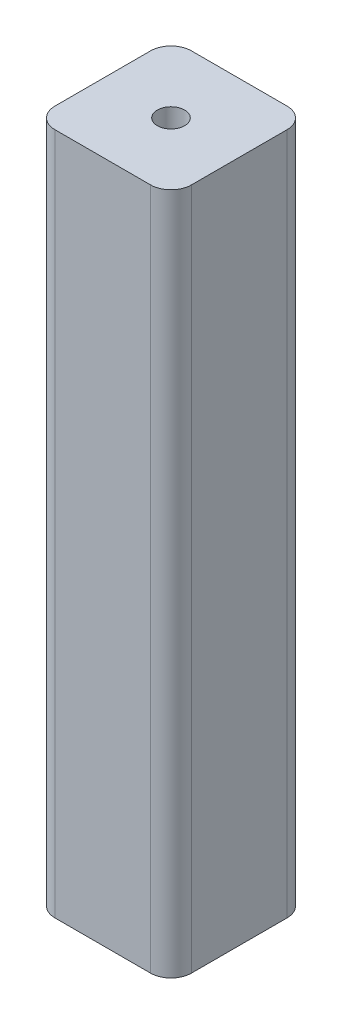
ISO-10303-21;
HEADER;
FILE_DESCRIPTION(('STEP AP214'),'2;1');
FILE_NAME('part.step','',(''),(''),'','','');
FILE_SCHEMA(('AUTOMOTIVE_DESIGN { 1 0 10303 214 1 1 1 1 }'));
ENDSEC;
DATA;
#1=APPLICATION_CONTEXT('core data for automotive mechanical design processes');
#2=APPLICATION_PROTOCOL_DEFINITION('international standard','automotive_design',2000,#1);
#3=PRODUCT_CONTEXT('',#1,'mechanical');
#4=PRODUCT('Part','Part','',(#3));
#5=PRODUCT_RELATED_PRODUCT_CATEGORY('part','',(#4));
#6=PRODUCT_DEFINITION_FORMATION('','',#4);
#7=PRODUCT_DEFINITION_CONTEXT('part definition',#1,'design');
#8=PRODUCT_DEFINITION('design','',#6,#7);
#9=PRODUCT_DEFINITION_SHAPE('','',#8);
#10=(LENGTH_UNIT() NAMED_UNIT(*) SI_UNIT(.MILLI.,.METRE.));
#11=(NAMED_UNIT(*) PLANE_ANGLE_UNIT() SI_UNIT($,.RADIAN.));
#12=(NAMED_UNIT(*) SI_UNIT($,.STERADIAN.) SOLID_ANGLE_UNIT());
#13=UNCERTAINTY_MEASURE_WITH_UNIT(LENGTH_MEASURE(1.E-05),#10,'distance_accuracy_value','');
#14=(GEOMETRIC_REPRESENTATION_CONTEXT(3) GLOBAL_UNCERTAINTY_ASSIGNED_CONTEXT((#13)) GLOBAL_UNIT_ASSIGNED_CONTEXT((#10,
#11,#12)) REPRESENTATION_CONTEXT('',''));
#15=CARTESIAN_POINT('',(0.,0.,0.));
#16=DIRECTION('',(0.,0.,1.));
#17=DIRECTION('',(1.,0.,0.));
#18=AXIS2_PLACEMENT_3D('',#15,#16,#17);
#19=CARTESIAN_POINT('',(-10.,100.,10.));
#20=DIRECTION('',(1.,0.,0.));
#21=DIRECTION('',(0.,0.,-1.));
#22=AXIS2_PLACEMENT_3D('',#19,#20,#21);
#23=PLANE('',#22);
#24=DIRECTION('',(0.,0.,1.));
#25=VECTOR('',#24,1.);
#26=CARTESIAN_POINT('',(-10.,0.,10.));
#27=LINE('',#26,#25);
#28=CARTESIAN_POINT('',(-10.,0.,-7.));
#29=VERTEX_POINT('',#28);
#30=CARTESIAN_POINT('',(-10.,0.,7.));
#31=VERTEX_POINT('',#30);
#32=EDGE_CURVE('E181',#29,#31,#27,.T.);
#33=ORIENTED_EDGE('',*,*,#32,.T.);
#34=DIRECTION('',(0.,-1.,0.));
#35=VECTOR('',#34,1.);
#36=CARTESIAN_POINT('',(-10.,100.,7.));
#37=LINE('',#36,#35);
#38=CARTESIAN_POINT('',(-10.,100.,7.));
#39=VERTEX_POINT('',#38);
#40=EDGE_CURVE('E11',#31,#39,#37,.F.);
#41=ORIENTED_EDGE('',*,*,#40,.T.);
#42=DIRECTION('',(0.,0.,1.));
#43=VECTOR('',#42,1.);
#44=CARTESIAN_POINT('',(-10.,100.,10.));
#45=LINE('',#44,#43);
#46=CARTESIAN_POINT('',(-10.,100.,-7.));
#47=VERTEX_POINT('',#46);
#48=EDGE_CURVE('E134',#47,#39,#45,.T.);
#49=ORIENTED_EDGE('',*,*,#48,.F.);
#50=DIRECTION('',(0.,-1.,0.));
#51=VECTOR('',#50,1.);
#52=CARTESIAN_POINT('',(-10.,100.,-7.));
#53=LINE('',#52,#51);
#54=EDGE_CURVE('E47',#47,#29,#53,.T.);
#55=ORIENTED_EDGE('',*,*,#54,.T.);
#56=EDGE_LOOP('',(#33,#41,#49,#55));
#57=FACE_BOUND('',#56,.T.);
#58=ADVANCED_FACE('F38',(#57),#23,.F.);
#59=CARTESIAN_POINT('',(10.,100.,10.));
#60=DIRECTION('',(0.,0.,-1.));
#61=DIRECTION('',(-1.,0.,0.));
#62=AXIS2_PLACEMENT_3D('',#59,#60,#61);
#63=PLANE('',#62);
#64=DIRECTION('',(1.,0.,0.));
#65=VECTOR('',#64,1.);
#66=CARTESIAN_POINT('',(10.,0.,10.));
#67=LINE('',#66,#65);
#68=CARTESIAN_POINT('',(-7.,0.,10.));
#69=VERTEX_POINT('',#68);
#70=CARTESIAN_POINT('',(7.,0.,10.));
#71=VERTEX_POINT('',#70);
#72=EDGE_CURVE('E141',#69,#71,#67,.T.);
#73=ORIENTED_EDGE('',*,*,#72,.T.);
#74=DIRECTION('',(0.,-1.,0.));
#75=VECTOR('',#74,1.);
#76=CARTESIAN_POINT('',(7.,100.,10.));
#77=LINE('',#76,#75);
#78=CARTESIAN_POINT('',(7.,100.,10.));
#79=VERTEX_POINT('',#78);
#80=EDGE_CURVE('E54',#71,#79,#77,.F.);
#81=ORIENTED_EDGE('',*,*,#80,.T.);
#82=DIRECTION('',(1.,0.,0.));
#83=VECTOR('',#82,1.);
#84=CARTESIAN_POINT('',(10.,100.,10.));
#85=LINE('',#84,#83);
#86=CARTESIAN_POINT('',(-7.,100.,10.));
#87=VERTEX_POINT('',#86);
#88=EDGE_CURVE('E139',#87,#79,#85,.T.);
#89=ORIENTED_EDGE('',*,*,#88,.F.);
#90=DIRECTION('',(0.,-1.,0.));
#91=VECTOR('',#90,1.);
#92=CARTESIAN_POINT('',(-7.,100.,10.));
#93=LINE('',#92,#91);
#94=EDGE_CURVE('E170',#87,#69,#93,.T.);
#95=ORIENTED_EDGE('',*,*,#94,.T.);
#96=EDGE_LOOP('',(#73,#81,#89,#95));
#97=FACE_BOUND('',#96,.T.);
#98=ADVANCED_FACE('F227',(#97),#63,.F.);
#99=CARTESIAN_POINT('',(10.,100.,10.));
#100=DIRECTION('',(-1.,0.,0.));
#101=DIRECTION('',(0.,0.,1.));
#102=AXIS2_PLACEMENT_3D('',#99,#100,#101);
#103=PLANE('',#102);
#104=DIRECTION('',(0.,0.,-1.));
#105=VECTOR('',#104,1.);
#106=CARTESIAN_POINT('',(10.,0.,10.));
#107=LINE('',#106,#105);
#108=CARTESIAN_POINT('',(10.,0.,7.));
#109=VERTEX_POINT('',#108);
#110=CARTESIAN_POINT('',(10.,0.,-7.));
#111=VERTEX_POINT('',#110);
#112=EDGE_CURVE('E135',#109,#111,#107,.T.);
#113=ORIENTED_EDGE('',*,*,#112,.T.);
#114=DIRECTION('',(0.,-1.,0.));
#115=VECTOR('',#114,1.);
#116=CARTESIAN_POINT('',(10.,100.,-7.));
#117=LINE('',#116,#115);
#118=CARTESIAN_POINT('',(10.,100.,-7.));
#119=VERTEX_POINT('',#118);
#120=EDGE_CURVE('E110',#111,#119,#117,.F.);
#121=ORIENTED_EDGE('',*,*,#120,.T.);
#122=DIRECTION('',(0.,0.,-1.));
#123=VECTOR('',#122,1.);
#124=CARTESIAN_POINT('',(10.,100.,10.));
#125=LINE('',#124,#123);
#126=CARTESIAN_POINT('',(10.,100.,7.));
#127=VERTEX_POINT('',#126);
#128=EDGE_CURVE('E197',#127,#119,#125,.T.);
#129=ORIENTED_EDGE('',*,*,#128,.F.);
#130=DIRECTION('',(0.,-1.,0.));
#131=VECTOR('',#130,1.);
#132=CARTESIAN_POINT('',(10.,100.,7.));
#133=LINE('',#132,#131);
#134=EDGE_CURVE('E116',#127,#109,#133,.T.);
#135=ORIENTED_EDGE('',*,*,#134,.T.);
#136=EDGE_LOOP('',(#113,#121,#129,#135));
#137=FACE_BOUND('',#136,.T.);
#138=ADVANCED_FACE('F232',(#137),#103,.F.);
#139=CARTESIAN_POINT('',(10.,100.,-10.));
#140=DIRECTION('',(0.,0.,1.));
#141=DIRECTION('',(1.,0.,0.));
#142=AXIS2_PLACEMENT_3D('',#139,#140,#141);
#143=PLANE('',#142);
#144=DIRECTION('',(-1.,0.,0.));
#145=VECTOR('',#144,1.);
#146=CARTESIAN_POINT('',(10.,100.,-10.));
#147=LINE('',#146,#145);
#148=CARTESIAN_POINT('',(7.,100.,-10.));
#149=VERTEX_POINT('',#148);
#150=CARTESIAN_POINT('',(-7.,100.,-10.));
#151=VERTEX_POINT('',#150);
#152=EDGE_CURVE('E126',#149,#151,#147,.T.);
#153=ORIENTED_EDGE('',*,*,#152,.F.);
#154=DIRECTION('',(0.,-1.,0.));
#155=VECTOR('',#154,1.);
#156=CARTESIAN_POINT('',(7.,100.,-10.));
#157=LINE('',#156,#155);
#158=CARTESIAN_POINT('',(7.,0.,-10.));
#159=VERTEX_POINT('',#158);
#160=EDGE_CURVE('E109',#149,#159,#157,.T.);
#161=ORIENTED_EDGE('',*,*,#160,.T.);
#162=DIRECTION('',(-1.,0.,0.));
#163=VECTOR('',#162,1.);
#164=CARTESIAN_POINT('',(10.,0.,-10.));
#165=LINE('',#164,#163);
#166=CARTESIAN_POINT('',(-7.,0.,-10.));
#167=VERTEX_POINT('',#166);
#168=EDGE_CURVE('E123',#159,#167,#165,.T.);
#169=ORIENTED_EDGE('',*,*,#168,.T.);
#170=DIRECTION('',(0.,-1.,0.));
#171=VECTOR('',#170,1.);
#172=CARTESIAN_POINT('',(-7.,100.,-10.));
#173=LINE('',#172,#171);
#174=EDGE_CURVE('E129',#167,#151,#173,.F.);
#175=ORIENTED_EDGE('',*,*,#174,.T.);
#176=EDGE_LOOP('',(#153,#161,#169,#175));
#177=FACE_BOUND('',#176,.T.);
#178=ADVANCED_FACE('F122',(#177),#143,.F.);
#179=CARTESIAN_POINT('',(0.,100.,0.));
#180=DIRECTION('',(0.,1.,0.));
#181=DIRECTION('',(0.,0.,1.));
#182=AXIS2_PLACEMENT_3D('',#179,#180,#181);
#183=PLANE('',#182);
#184=CARTESIAN_POINT('',(0.,100.,0.));
#185=DIRECTION('',(0.,1.,0.));
#186=DIRECTION('',(0.,0.,1.));
#187=AXIS2_PLACEMENT_3D('',#184,#185,#186);
#188=CIRCLE('',#187,2.);
#189=CARTESIAN_POINT('',(0.,100.,2.));
#190=VERTEX_POINT('',#189);
#191=EDGE_CURVE('E192',#190,#190,#188,.T.);
#192=ORIENTED_EDGE('',*,*,#191,.F.);
#193=EDGE_LOOP('',(#192));
#194=FACE_BOUND('',#193,.T.);
#195=ORIENTED_EDGE('',*,*,#128,.T.);
#196=CARTESIAN_POINT('',(7.,100.,-7.));
#197=DIRECTION('',(0.,1.,0.));
#198=DIRECTION('',(0.,0.,1.));
#199=AXIS2_PLACEMENT_3D('',#196,#197,#198);
#200=CIRCLE('',#199,3.);
#201=EDGE_CURVE('E167',#119,#149,#200,.T.);
#202=ORIENTED_EDGE('',*,*,#201,.T.);
#203=ORIENTED_EDGE('',*,*,#152,.T.);
#204=CARTESIAN_POINT('',(-7.,100.,-7.));
#205=DIRECTION('',(0.,1.,0.));
#206=DIRECTION('',(0.,0.,1.));
#207=AXIS2_PLACEMENT_3D('',#204,#205,#206);
#208=CIRCLE('',#207,3.);
#209=EDGE_CURVE('E159',#151,#47,#208,.T.);
#210=ORIENTED_EDGE('',*,*,#209,.T.);
#211=ORIENTED_EDGE('',*,*,#48,.T.);
#212=CARTESIAN_POINT('',(-7.,100.,7.));
#213=DIRECTION('',(0.,1.,0.));
#214=DIRECTION('',(0.,0.,1.));
#215=AXIS2_PLACEMENT_3D('',#212,#213,#214);
#216=CIRCLE('',#215,3.);
#217=EDGE_CURVE('E61',#39,#87,#216,.T.);
#218=ORIENTED_EDGE('',*,*,#217,.T.);
#219=ORIENTED_EDGE('',*,*,#88,.T.);
#220=CARTESIAN_POINT('',(7.,100.,7.));
#221=DIRECTION('',(0.,1.,0.));
#222=DIRECTION('',(0.,0.,1.));
#223=AXIS2_PLACEMENT_3D('',#220,#221,#222);
#224=CIRCLE('',#223,3.);
#225=EDGE_CURVE('E164',#79,#127,#224,.T.);
#226=ORIENTED_EDGE('',*,*,#225,.T.);
#227=EDGE_LOOP('',(#195,#202,#203,#210,#211,#218,#219,#226));
#228=FACE_BOUND('',#227,.T.);
#229=ADVANCED_FACE('F253',(#194,#228),#183,.T.);
#230=CARTESIAN_POINT('',(0.,0.,0.));
#231=DIRECTION('',(0.,1.,0.));
#232=DIRECTION('',(0.,0.,1.));
#233=AXIS2_PLACEMENT_3D('',#230,#231,#232);
#234=PLANE('',#233);
#235=CARTESIAN_POINT('',(0.,0.,0.));
#236=DIRECTION('',(0.,1.,0.));
#237=DIRECTION('',(0.,0.,1.));
#238=AXIS2_PLACEMENT_3D('',#235,#236,#237);
#239=CIRCLE('',#238,2.);
#240=CARTESIAN_POINT('',(0.,0.,2.));
#241=VERTEX_POINT('',#240);
#242=EDGE_CURVE('E207',#241,#241,#239,.T.);
#243=ORIENTED_EDGE('',*,*,#242,.T.);
#244=EDGE_LOOP('',(#243));
#245=FACE_BOUND('',#244,.T.);
#246=ORIENTED_EDGE('',*,*,#168,.F.);
#247=CARTESIAN_POINT('',(7.,0.,-7.));
#248=DIRECTION('',(0.,1.,0.));
#249=DIRECTION('',(0.,0.,1.));
#250=AXIS2_PLACEMENT_3D('',#247,#248,#249);
#251=CIRCLE('',#250,3.);
#252=EDGE_CURVE('E105',#159,#111,#251,.F.);
#253=ORIENTED_EDGE('',*,*,#252,.T.);
#254=ORIENTED_EDGE('',*,*,#112,.F.);
#255=CARTESIAN_POINT('',(7.,0.,7.));
#256=DIRECTION('',(0.,1.,0.));
#257=DIRECTION('',(0.,0.,1.));
#258=AXIS2_PLACEMENT_3D('',#255,#256,#257);
#259=CIRCLE('',#258,3.);
#260=EDGE_CURVE('E117',#109,#71,#259,.F.);
#261=ORIENTED_EDGE('',*,*,#260,.T.);
#262=ORIENTED_EDGE('',*,*,#72,.F.);
#263=CARTESIAN_POINT('',(-7.,0.,7.));
#264=DIRECTION('',(0.,1.,0.));
#265=DIRECTION('',(0.,0.,1.));
#266=AXIS2_PLACEMENT_3D('',#263,#264,#265);
#267=CIRCLE('',#266,3.);
#268=EDGE_CURVE('E149',#69,#31,#267,.F.);
#269=ORIENTED_EDGE('',*,*,#268,.T.);
#270=ORIENTED_EDGE('',*,*,#32,.F.);
#271=CARTESIAN_POINT('',(-7.,0.,-7.));
#272=DIRECTION('',(0.,1.,0.));
#273=DIRECTION('',(0.,0.,1.));
#274=AXIS2_PLACEMENT_3D('',#271,#272,#273);
#275=CIRCLE('',#274,3.);
#276=EDGE_CURVE('E128',#29,#167,#275,.F.);
#277=ORIENTED_EDGE('',*,*,#276,.T.);
#278=EDGE_LOOP('',(#246,#253,#254,#261,#262,#269,#270,#277));
#279=FACE_BOUND('',#278,.T.);
#280=ADVANCED_FACE('F131',(#245,#279),#234,.F.);
#281=CARTESIAN_POINT('',(7.,100.,-7.));
#282=DIRECTION('',(0.,-1.,0.));
#283=DIRECTION('',(0.,0.,-1.));
#284=AXIS2_PLACEMENT_3D('',#281,#282,#283);
#285=CYLINDRICAL_SURFACE('',#284,3.);
#286=ORIENTED_EDGE('',*,*,#201,.F.);
#287=ORIENTED_EDGE('',*,*,#120,.F.);
#288=ORIENTED_EDGE('',*,*,#252,.F.);
#289=ORIENTED_EDGE('',*,*,#160,.F.);
#290=EDGE_LOOP('',(#286,#287,#288,#289));
#291=FACE_BOUND('',#290,.T.);
#292=ADVANCED_FACE('F108',(#291),#285,.T.);
#293=CARTESIAN_POINT('',(7.,100.,7.));
#294=DIRECTION('',(0.,-1.,0.));
#295=DIRECTION('',(0.,0.,-1.));
#296=AXIS2_PLACEMENT_3D('',#293,#294,#295);
#297=CYLINDRICAL_SURFACE('',#296,3.);
#298=ORIENTED_EDGE('',*,*,#225,.F.);
#299=ORIENTED_EDGE('',*,*,#80,.F.);
#300=ORIENTED_EDGE('',*,*,#260,.F.);
#301=ORIENTED_EDGE('',*,*,#134,.F.);
#302=EDGE_LOOP('',(#298,#299,#300,#301));
#303=FACE_BOUND('',#302,.T.);
#304=ADVANCED_FACE('F238',(#303),#297,.T.);
#305=CARTESIAN_POINT('',(-7.,100.,7.));
#306=DIRECTION('',(0.,-1.,0.));
#307=DIRECTION('',(0.,0.,-1.));
#308=AXIS2_PLACEMENT_3D('',#305,#306,#307);
#309=CYLINDRICAL_SURFACE('',#308,3.);
#310=ORIENTED_EDGE('',*,*,#217,.F.);
#311=ORIENTED_EDGE('',*,*,#40,.F.);
#312=ORIENTED_EDGE('',*,*,#268,.F.);
#313=ORIENTED_EDGE('',*,*,#94,.F.);
#314=EDGE_LOOP('',(#310,#311,#312,#313));
#315=FACE_BOUND('',#314,.T.);
#316=ADVANCED_FACE('F240',(#315),#309,.T.);
#317=CARTESIAN_POINT('',(-7.,100.,-7.));
#318=DIRECTION('',(0.,-1.,0.));
#319=DIRECTION('',(0.,0.,-1.));
#320=AXIS2_PLACEMENT_3D('',#317,#318,#319);
#321=CYLINDRICAL_SURFACE('',#320,3.);
#322=ORIENTED_EDGE('',*,*,#209,.F.);
#323=ORIENTED_EDGE('',*,*,#174,.F.);
#324=ORIENTED_EDGE('',*,*,#276,.F.);
#325=ORIENTED_EDGE('',*,*,#54,.F.);
#326=EDGE_LOOP('',(#322,#323,#324,#325));
#327=FACE_BOUND('',#326,.T.);
#328=ADVANCED_FACE('F40',(#327),#321,.T.);
#329=CARTESIAN_POINT('',(0.,90.,0.));
#330=DIRECTION('',(0.,1.,0.));
#331=DIRECTION('',(0.,0.,1.));
#332=AXIS2_PLACEMENT_3D('',#329,#330,#331);
#333=CYLINDRICAL_SURFACE('',#332,2.);
#334=CARTESIAN_POINT('',(0.,90.,0.));
#335=DIRECTION('',(0.,1.,0.));
#336=DIRECTION('',(0.,0.,1.));
#337=AXIS2_PLACEMENT_3D('',#334,#335,#336);
#338=CIRCLE('',#337,2.);
#339=CARTESIAN_POINT('',(0.,90.,2.));
#340=VERTEX_POINT('',#339);
#341=EDGE_CURVE('E187',#340,#340,#338,.T.);
#342=ORIENTED_EDGE('',*,*,#341,.F.);
#343=EDGE_LOOP('',(#342));
#344=FACE_BOUND('',#343,.T.);
#345=ORIENTED_EDGE('',*,*,#191,.T.);
#346=EDGE_LOOP('',(#345));
#347=FACE_BOUND('',#346,.T.);
#348=ADVANCED_FACE('F247',(#344,#347),#333,.F.);
#349=CARTESIAN_POINT('',(0.,90.,0.));
#350=DIRECTION('',(0.,1.,0.));
#351=DIRECTION('',(0.,0.,1.));
#352=AXIS2_PLACEMENT_3D('',#349,#350,#351);
#353=PLANE('',#352);
#354=ORIENTED_EDGE('',*,*,#341,.T.);
#355=EDGE_LOOP('',(#354));
#356=FACE_BOUND('',#355,.T.);
#357=ADVANCED_FACE('F224',(#356),#353,.T.);
#358=CARTESIAN_POINT('',(0.,10.,0.));
#359=DIRECTION('',(0.,-1.,0.));
#360=DIRECTION('',(0.,0.,-1.));
#361=AXIS2_PLACEMENT_3D('',#358,#359,#360);
#362=CYLINDRICAL_SURFACE('',#361,2.);
#363=CARTESIAN_POINT('',(0.,10.,0.));
#364=DIRECTION('',(0.,1.,0.));
#365=DIRECTION('',(0.,0.,1.));
#366=AXIS2_PLACEMENT_3D('',#363,#364,#365);
#367=CIRCLE('',#366,2.);
#368=CARTESIAN_POINT('',(0.,10.,2.));
#369=VERTEX_POINT('',#368);
#370=EDGE_CURVE('E205',#369,#369,#367,.T.);
#371=ORIENTED_EDGE('',*,*,#370,.T.);
#372=EDGE_LOOP('',(#371));
#373=FACE_BOUND('',#372,.T.);
#374=ORIENTED_EDGE('',*,*,#242,.F.);
#375=EDGE_LOOP('',(#374));
#376=FACE_BOUND('',#375,.T.);
#377=ADVANCED_FACE('F215',(#373,#376),#362,.F.);
#378=CARTESIAN_POINT('',(0.,10.,0.));
#379=DIRECTION('',(0.,-1.,0.));
#380=DIRECTION('',(0.,0.,1.));
#381=AXIS2_PLACEMENT_3D('',#378,#379,#380);
#382=PLANE('',#381);
#383=ORIENTED_EDGE('',*,*,#370,.F.);
#384=EDGE_LOOP('',(#383));
#385=FACE_BOUND('',#384,.T.);
#386=ADVANCED_FACE('F218',(#385),#382,.T.);
#387=CLOSED_SHELL('',(#58,#98,#138,#178,#229,#280,#292,#304,#316,#328,#348,#357,#377,#386));
#388=MANIFOLD_SOLID_BREP('B2',#387);
#389=ADVANCED_BREP_SHAPE_REPRESENTATION('',(#18,#388),#14);
#390=SHAPE_DEFINITION_REPRESENTATION(#9,#389);
ENDSEC;
END-ISO-10303-21;
